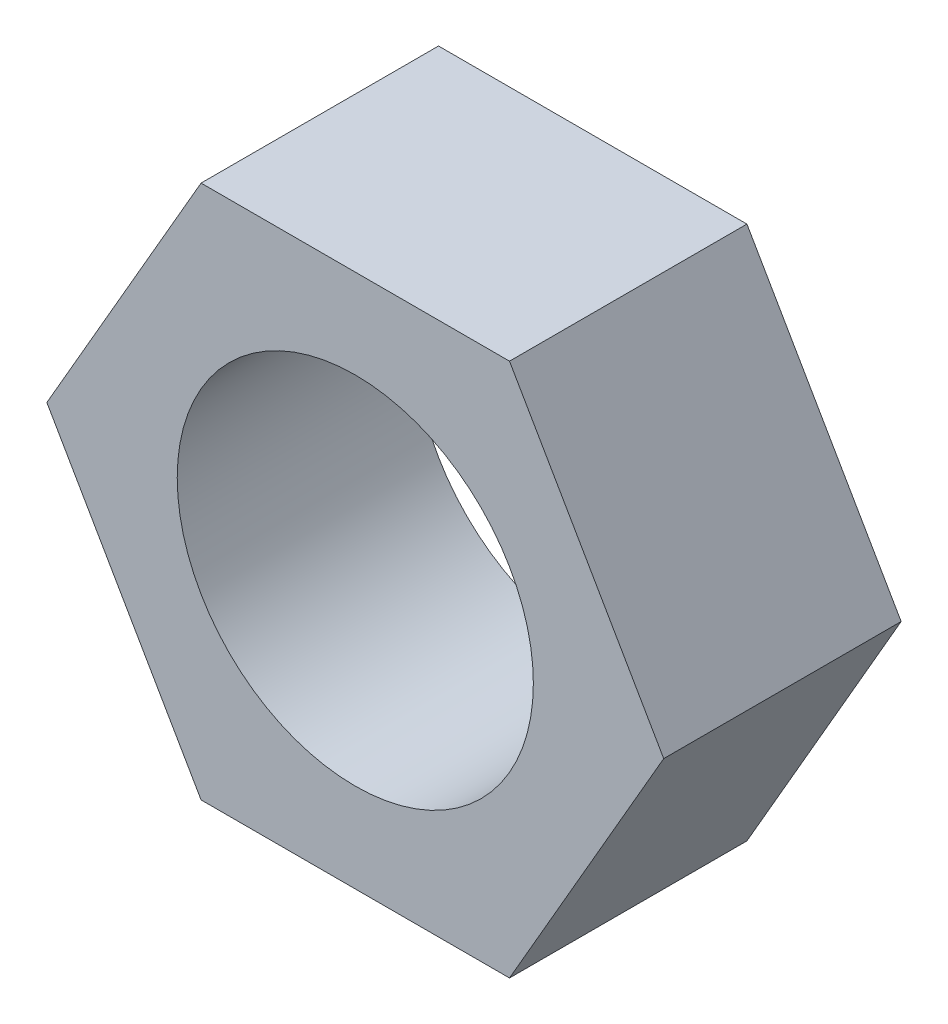
ISO-10303-21;
HEADER;
FILE_DESCRIPTION(('STEP AP214'),'2;1');
FILE_NAME('part.step','',(''),(''),'','','');
FILE_SCHEMA(('AUTOMOTIVE_DESIGN { 1 0 10303 214 1 1 1 1 }'));
ENDSEC;
DATA;
#1=APPLICATION_CONTEXT('core data for automotive mechanical design processes');
#2=APPLICATION_PROTOCOL_DEFINITION('international standard','automotive_design',2000,#1);
#3=PRODUCT_CONTEXT('',#1,'mechanical');
#4=PRODUCT('Part','Part','',(#3));
#5=PRODUCT_RELATED_PRODUCT_CATEGORY('part','',(#4));
#6=PRODUCT_DEFINITION_FORMATION('','',#4);
#7=PRODUCT_DEFINITION_CONTEXT('part definition',#1,'design');
#8=PRODUCT_DEFINITION('design','',#6,#7);
#9=PRODUCT_DEFINITION_SHAPE('','',#8);
#10=(LENGTH_UNIT() NAMED_UNIT(*) SI_UNIT(.MILLI.,.METRE.));
#11=(NAMED_UNIT(*) PLANE_ANGLE_UNIT() SI_UNIT($,.RADIAN.));
#12=(NAMED_UNIT(*) SI_UNIT($,.STERADIAN.) SOLID_ANGLE_UNIT());
#13=UNCERTAINTY_MEASURE_WITH_UNIT(LENGTH_MEASURE(1.E-05),#10,'distance_accuracy_value','');
#14=(GEOMETRIC_REPRESENTATION_CONTEXT(3) GLOBAL_UNCERTAINTY_ASSIGNED_CONTEXT((#13)) GLOBAL_UNIT_ASSIGNED_CONTEXT((#10,
#11,#12)) REPRESENTATION_CONTEXT('',''));
#15=CARTESIAN_POINT('',(0.,0.,0.));
#16=DIRECTION('',(0.,0.,1.));
#17=DIRECTION('',(1.,0.,0.));
#18=AXIS2_PLACEMENT_3D('',#15,#16,#17);
#19=CARTESIAN_POINT('',(0.,0.,2.));
#20=DIRECTION('',(0.,0.,1.));
#21=DIRECTION('',(1.,0.,0.));
#22=AXIS2_PLACEMENT_3D('',#19,#20,#21);
#23=PLANE('',#22);
#24=DIRECTION('',(0.499999999999995,0.866025403784442,0.));
#25=VECTOR('',#24,1.);
#26=CARTESIAN_POINT('',(1.29903810567668,-2.24999999999998,2.));
#27=LINE('',#26,#25);
#28=CARTESIAN_POINT('',(1.29903810567668,-2.24999999999998,2.));
#29=VERTEX_POINT('',#28);
#30=CARTESIAN_POINT('',(2.59807621135331,0.,2.));
#31=VERTEX_POINT('',#30);
#32=EDGE_CURVE('E148',#29,#31,#27,.T.);
#33=ORIENTED_EDGE('',*,*,#32,.T.);
#34=DIRECTION('',(-0.500000000000001,0.866025403784438,0.));
#35=VECTOR('',#34,1.);
#36=CARTESIAN_POINT('',(2.59807621135331,0.,2.));
#37=LINE('',#36,#35);
#38=CARTESIAN_POINT('',(1.29903810567665,2.25,2.));
#39=VERTEX_POINT('',#38);
#40=EDGE_CURVE('E96',#31,#39,#37,.T.);
#41=ORIENTED_EDGE('',*,*,#40,.T.);
#42=DIRECTION('',(-1.,0.,0.));
#43=VECTOR('',#42,1.);
#44=CARTESIAN_POINT('',(1.29903810567665,2.25,2.));
#45=LINE('',#44,#43);
#46=CARTESIAN_POINT('',(-1.29903810567666,2.24999999999999,2.));
#47=VERTEX_POINT('',#46);
#48=EDGE_CURVE('E109',#39,#47,#45,.T.);
#49=ORIENTED_EDGE('',*,*,#48,.T.);
#50=DIRECTION('',(-0.499999999999995,-0.866025403784442,0.));
#51=VECTOR('',#50,1.);
#52=CARTESIAN_POINT('',(-1.29903810567666,2.24999999999999,2.));
#53=LINE('',#52,#51);
#54=CARTESIAN_POINT('',(-2.59807621135331,0.,2.));
#55=VERTEX_POINT('',#54);
#56=EDGE_CURVE('E103',#47,#55,#53,.T.);
#57=ORIENTED_EDGE('',*,*,#56,.T.);
#58=DIRECTION('',(0.500000000000007,-0.866025403784434,0.));
#59=VECTOR('',#58,1.);
#60=CARTESIAN_POINT('',(-2.59807621135331,0.,2.));
#61=LINE('',#60,#59);
#62=CARTESIAN_POINT('',(-1.29903810567663,-2.25,2.));
#63=VERTEX_POINT('',#62);
#64=EDGE_CURVE('E107',#55,#63,#61,.T.);
#65=ORIENTED_EDGE('',*,*,#64,.T.);
#66=DIRECTION('',(1.,0.,0.));
#67=VECTOR('',#66,1.);
#68=CARTESIAN_POINT('',(-1.29903810567663,-2.25,2.));
#69=LINE('',#68,#67);
#70=EDGE_CURVE('E59',#63,#29,#69,.T.);
#71=ORIENTED_EDGE('',*,*,#70,.T.);
#72=EDGE_LOOP('',(#33,#41,#49,#57,#65,#71));
#73=FACE_BOUND('',#72,.T.);
#74=CARTESIAN_POINT('',(0.,0.,2.));
#75=DIRECTION('',(0.,0.,1.));
#76=DIRECTION('',(1.,0.,0.));
#77=AXIS2_PLACEMENT_3D('',#74,#75,#76);
#78=CIRCLE('',#77,1.5);
#79=CARTESIAN_POINT('',(1.5,0.,2.));
#80=VERTEX_POINT('',#79);
#81=EDGE_CURVE('E136',#80,#80,#78,.T.);
#82=ORIENTED_EDGE('',*,*,#81,.F.);
#83=EDGE_LOOP('',(#82));
#84=FACE_BOUND('',#83,.T.);
#85=ADVANCED_FACE('F41',(#73,#84),#23,.T.);
#86=CARTESIAN_POINT('',(0.,0.,0.));
#87=DIRECTION('',(0.,0.,1.));
#88=DIRECTION('',(1.,0.,0.));
#89=AXIS2_PLACEMENT_3D('',#86,#87,#88);
#90=PLANE('',#89);
#91=DIRECTION('',(0.499999999999995,0.866025403784442,0.));
#92=VECTOR('',#91,1.);
#93=CARTESIAN_POINT('',(1.29903810567668,-2.24999999999998,0.));
#94=LINE('',#93,#92);
#95=CARTESIAN_POINT('',(1.29903810567668,-2.24999999999998,0.));
#96=VERTEX_POINT('',#95);
#97=CARTESIAN_POINT('',(2.59807621135331,0.,0.));
#98=VERTEX_POINT('',#97);
#99=EDGE_CURVE('E131',#96,#98,#94,.T.);
#100=ORIENTED_EDGE('',*,*,#99,.F.);
#101=DIRECTION('',(1.,0.,0.));
#102=VECTOR('',#101,1.);
#103=CARTESIAN_POINT('',(-1.29903810567663,-2.25,0.));
#104=LINE('',#103,#102);
#105=CARTESIAN_POINT('',(-1.29903810567663,-2.25,0.));
#106=VERTEX_POINT('',#105);
#107=EDGE_CURVE('E88',#106,#96,#104,.T.);
#108=ORIENTED_EDGE('',*,*,#107,.F.);
#109=DIRECTION('',(0.500000000000007,-0.866025403784434,0.));
#110=VECTOR('',#109,1.);
#111=CARTESIAN_POINT('',(-2.59807621135331,0.,0.));
#112=LINE('',#111,#110);
#113=CARTESIAN_POINT('',(-2.59807621135331,0.,0.));
#114=VERTEX_POINT('',#113);
#115=EDGE_CURVE('E82',#114,#106,#112,.T.);
#116=ORIENTED_EDGE('',*,*,#115,.F.);
#117=DIRECTION('',(-0.499999999999995,-0.866025403784442,0.));
#118=VECTOR('',#117,1.);
#119=CARTESIAN_POINT('',(-1.29903810567666,2.24999999999999,0.));
#120=LINE('',#119,#118);
#121=CARTESIAN_POINT('',(-1.29903810567666,2.24999999999999,0.));
#122=VERTEX_POINT('',#121);
#123=EDGE_CURVE('E118',#122,#114,#120,.T.);
#124=ORIENTED_EDGE('',*,*,#123,.F.);
#125=DIRECTION('',(-1.,0.,0.));
#126=VECTOR('',#125,1.);
#127=CARTESIAN_POINT('',(1.29903810567665,2.25,0.));
#128=LINE('',#127,#126);
#129=CARTESIAN_POINT('',(1.29903810567665,2.25,0.));
#130=VERTEX_POINT('',#129);
#131=EDGE_CURVE('E139',#130,#122,#128,.T.);
#132=ORIENTED_EDGE('',*,*,#131,.F.);
#133=DIRECTION('',(-0.500000000000001,0.866025403784438,0.));
#134=VECTOR('',#133,1.);
#135=CARTESIAN_POINT('',(2.59807621135331,0.,0.));
#136=LINE('',#135,#134);
#137=EDGE_CURVE('E135',#98,#130,#136,.T.);
#138=ORIENTED_EDGE('',*,*,#137,.F.);
#139=EDGE_LOOP('',(#100,#108,#116,#124,#132,#138));
#140=FACE_BOUND('',#139,.T.);
#141=CARTESIAN_POINT('',(0.,0.,0.));
#142=DIRECTION('',(0.,0.,1.));
#143=DIRECTION('',(1.,0.,0.));
#144=AXIS2_PLACEMENT_3D('',#141,#142,#143);
#145=CIRCLE('',#144,1.5);
#146=CARTESIAN_POINT('',(1.5,0.,0.));
#147=VERTEX_POINT('',#146);
#148=EDGE_CURVE('E245',#147,#147,#145,.T.);
#149=ORIENTED_EDGE('',*,*,#148,.T.);
#150=EDGE_LOOP('',(#149));
#151=FACE_BOUND('',#150,.T.);
#152=ADVANCED_FACE('F161',(#140,#151),#90,.F.);
#153=CARTESIAN_POINT('',(1.29903810567668,-2.24999999999998,2.));
#154=DIRECTION('',(-0.866025403784442,0.499999999999995,0.));
#155=DIRECTION('',(-0.499999999999995,-0.866025403784442,0.));
#156=AXIS2_PLACEMENT_3D('',#153,#154,#155);
#157=PLANE('',#156);
#158=ORIENTED_EDGE('',*,*,#99,.T.);
#159=DIRECTION('',(0.,0.,-1.));
#160=VECTOR('',#159,1.);
#161=CARTESIAN_POINT('',(2.59807621135331,0.,2.));
#162=LINE('',#161,#160);
#163=EDGE_CURVE('E11',#31,#98,#162,.T.);
#164=ORIENTED_EDGE('',*,*,#163,.F.);
#165=ORIENTED_EDGE('',*,*,#32,.F.);
#166=DIRECTION('',(0.,0.,-1.));
#167=VECTOR('',#166,1.);
#168=CARTESIAN_POINT('',(1.29903810567668,-2.24999999999998,2.));
#169=LINE('',#168,#167);
#170=EDGE_CURVE('E127',#29,#96,#169,.T.);
#171=ORIENTED_EDGE('',*,*,#170,.T.);
#172=EDGE_LOOP('',(#158,#164,#165,#171));
#173=FACE_BOUND('',#172,.T.);
#174=ADVANCED_FACE('F43',(#173),#157,.F.);
#175=CARTESIAN_POINT('',(2.59807621135331,0.,2.));
#176=DIRECTION('',(-0.866025403784438,-0.500000000000001,0.));
#177=DIRECTION('',(0.500000000000001,-0.866025403784438,0.));
#178=AXIS2_PLACEMENT_3D('',#175,#176,#177);
#179=PLANE('',#178);
#180=ORIENTED_EDGE('',*,*,#137,.T.);
#181=DIRECTION('',(0.,0.,-1.));
#182=VECTOR('',#181,1.);
#183=CARTESIAN_POINT('',(1.29903810567665,2.25,2.));
#184=LINE('',#183,#182);
#185=EDGE_CURVE('E51',#39,#130,#184,.T.);
#186=ORIENTED_EDGE('',*,*,#185,.F.);
#187=ORIENTED_EDGE('',*,*,#40,.F.);
#188=ORIENTED_EDGE('',*,*,#163,.T.);
#189=EDGE_LOOP('',(#180,#186,#187,#188));
#190=FACE_BOUND('',#189,.T.);
#191=ADVANCED_FACE('F186',(#190),#179,.F.);
#192=CARTESIAN_POINT('',(1.29903810567665,2.25,2.));
#193=DIRECTION('',(0.,-1.,0.));
#194=DIRECTION('',(1.,0.,0.));
#195=AXIS2_PLACEMENT_3D('',#192,#193,#194);
#196=PLANE('',#195);
#197=ORIENTED_EDGE('',*,*,#131,.T.);
#198=DIRECTION('',(0.,0.,-1.));
#199=VECTOR('',#198,1.);
#200=CARTESIAN_POINT('',(-1.29903810567666,2.24999999999999,2.));
#201=LINE('',#200,#199);
#202=EDGE_CURVE('E120',#47,#122,#201,.T.);
#203=ORIENTED_EDGE('',*,*,#202,.F.);
#204=ORIENTED_EDGE('',*,*,#48,.F.);
#205=ORIENTED_EDGE('',*,*,#185,.T.);
#206=EDGE_LOOP('',(#197,#203,#204,#205));
#207=FACE_BOUND('',#206,.T.);
#208=ADVANCED_FACE('F158',(#207),#196,.F.);
#209=CARTESIAN_POINT('',(-1.29903810567666,2.24999999999999,2.));
#210=DIRECTION('',(0.866025403784442,-0.499999999999995,0.));
#211=DIRECTION('',(0.499999999999995,0.866025403784442,0.));
#212=AXIS2_PLACEMENT_3D('',#209,#210,#211);
#213=PLANE('',#212);
#214=ORIENTED_EDGE('',*,*,#123,.T.);
#215=DIRECTION('',(0.,0.,-1.));
#216=VECTOR('',#215,1.);
#217=CARTESIAN_POINT('',(-2.59807621135331,0.,2.));
#218=LINE('',#217,#216);
#219=EDGE_CURVE('E115',#55,#114,#218,.T.);
#220=ORIENTED_EDGE('',*,*,#219,.F.);
#221=ORIENTED_EDGE('',*,*,#56,.F.);
#222=ORIENTED_EDGE('',*,*,#202,.T.);
#223=EDGE_LOOP('',(#214,#220,#221,#222));
#224=FACE_BOUND('',#223,.T.);
#225=ADVANCED_FACE('F116',(#224),#213,.F.);
#226=CARTESIAN_POINT('',(-2.59807621135331,0.,2.));
#227=DIRECTION('',(0.866025403784435,0.500000000000007,0.));
#228=DIRECTION('',(-0.500000000000007,0.866025403784435,0.));
#229=AXIS2_PLACEMENT_3D('',#226,#227,#228);
#230=PLANE('',#229);
#231=ORIENTED_EDGE('',*,*,#115,.T.);
#232=DIRECTION('',(0.,0.,-1.));
#233=VECTOR('',#232,1.);
#234=CARTESIAN_POINT('',(-1.29903810567663,-2.25,2.));
#235=LINE('',#234,#233);
#236=EDGE_CURVE('E121',#63,#106,#235,.T.);
#237=ORIENTED_EDGE('',*,*,#236,.F.);
#238=ORIENTED_EDGE('',*,*,#64,.F.);
#239=ORIENTED_EDGE('',*,*,#219,.T.);
#240=EDGE_LOOP('',(#231,#237,#238,#239));
#241=FACE_BOUND('',#240,.T.);
#242=ADVANCED_FACE('F123',(#241),#230,.F.);
#243=CARTESIAN_POINT('',(-1.29903810567663,-2.25,2.));
#244=DIRECTION('',(0.,1.,0.));
#245=DIRECTION('',(-1.,0.,0.));
#246=AXIS2_PLACEMENT_3D('',#243,#244,#245);
#247=PLANE('',#246);
#248=ORIENTED_EDGE('',*,*,#107,.T.);
#249=ORIENTED_EDGE('',*,*,#170,.F.);
#250=ORIENTED_EDGE('',*,*,#70,.F.);
#251=ORIENTED_EDGE('',*,*,#236,.T.);
#252=EDGE_LOOP('',(#248,#249,#250,#251));
#253=FACE_BOUND('',#252,.T.);
#254=ADVANCED_FACE('F166',(#253),#247,.F.);
#255=CARTESIAN_POINT('',(0.,0.,2.));
#256=DIRECTION('',(0.,0.,-1.));
#257=DIRECTION('',(-1.,0.,0.));
#258=AXIS2_PLACEMENT_3D('',#255,#256,#257);
#259=CYLINDRICAL_SURFACE('',#258,1.5);
#260=ORIENTED_EDGE('',*,*,#81,.T.);
#261=EDGE_LOOP('',(#260));
#262=FACE_BOUND('',#261,.T.);
#263=ORIENTED_EDGE('',*,*,#148,.F.);
#264=EDGE_LOOP('',(#263));
#265=FACE_BOUND('',#264,.T.);
#266=ADVANCED_FACE('F168',(#262,#265),#259,.F.);
#267=CLOSED_SHELL('',(#85,#152,#174,#191,#208,#225,#242,#254,#266));
#268=MANIFOLD_SOLID_BREP('B2',#267);
#269=ADVANCED_BREP_SHAPE_REPRESENTATION('',(#18,#268),#14);
#270=SHAPE_DEFINITION_REPRESENTATION(#9,#269);
ENDSEC;
END-ISO-10303-21;
